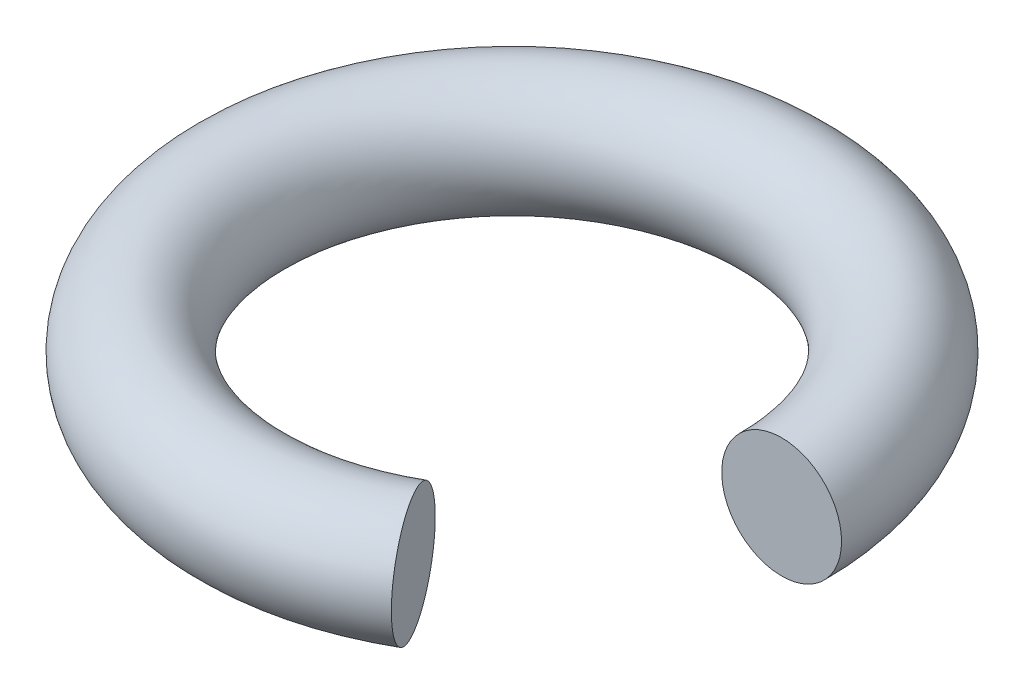
ISO-10303-21;
HEADER;
FILE_DESCRIPTION(('STEP AP214'),'2;1');
FILE_NAME('part.step','',(''),(''),'','','');
FILE_SCHEMA(('AUTOMOTIVE_DESIGN { 1 0 10303 214 1 1 1 1 }'));
ENDSEC;
DATA;
#1=APPLICATION_CONTEXT('core data for automotive mechanical design processes');
#2=APPLICATION_PROTOCOL_DEFINITION('international standard','automotive_design',2000,#1);
#3=PRODUCT_CONTEXT('',#1,'mechanical');
#4=PRODUCT('Part','Part','',(#3));
#5=PRODUCT_RELATED_PRODUCT_CATEGORY('part','',(#4));
#6=PRODUCT_DEFINITION_FORMATION('','',#4);
#7=PRODUCT_DEFINITION_CONTEXT('part definition',#1,'design');
#8=PRODUCT_DEFINITION('design','',#6,#7);
#9=PRODUCT_DEFINITION_SHAPE('','',#8);
#10=(LENGTH_UNIT() NAMED_UNIT(*) SI_UNIT(.MILLI.,.METRE.));
#11=(NAMED_UNIT(*) PLANE_ANGLE_UNIT() SI_UNIT($,.RADIAN.));
#12=(NAMED_UNIT(*) SI_UNIT($,.STERADIAN.) SOLID_ANGLE_UNIT());
#13=UNCERTAINTY_MEASURE_WITH_UNIT(LENGTH_MEASURE(1.E-05),#10,'distance_accuracy_value','');
#14=(GEOMETRIC_REPRESENTATION_CONTEXT(3) GLOBAL_UNCERTAINTY_ASSIGNED_CONTEXT((#13)) GLOBAL_UNIT_ASSIGNED_CONTEXT((#10,
#11,#12)) REPRESENTATION_CONTEXT('',''));
#15=CARTESIAN_POINT('',(0.,0.,0.));
#16=DIRECTION('',(0.,0.,1.));
#17=DIRECTION('',(1.,0.,0.));
#18=AXIS2_PLACEMENT_3D('',#15,#16,#17);
#19=CARTESIAN_POINT('',(0.,0.,0.));
#20=DIRECTION('',(0.,-1.,0.));
#21=DIRECTION('',(0.,0.,-1.));
#22=AXIS2_PLACEMENT_3D('',#19,#20,#21);
#23=TOROIDAL_SURFACE('',#22,2.7,0.6);
#24=CARTESIAN_POINT('',(1.35,0.,2.33826859021798));
#25=DIRECTION('',(-0.866025403784439,0.,0.5));
#26=DIRECTION('',(0.5,0.,0.866025403784439));
#27=AXIS2_PLACEMENT_3D('',#24,#25,#26);
#28=CIRCLE('',#27,0.6);
#29=CARTESIAN_POINT('',(1.65,0.,2.85788383248865));
#30=VERTEX_POINT('',#29);
#31=EDGE_CURVE('E10',#30,#30,#28,.T.);
#32=CARTESIAN_POINT('',(2.7,0.,0.));
#33=DIRECTION('',(0.,0.,1.));
#34=DIRECTION('',(1.,0.,0.));
#35=AXIS2_PLACEMENT_3D('',#32,#33,#34);
#36=CIRCLE('',#35,0.6);
#37=CARTESIAN_POINT('',(3.3,0.,0.));
#38=VERTEX_POINT('',#37);
#39=EDGE_CURVE('E41',#38,#38,#36,.T.);
#40=CARTESIAN_POINT('',(0.,0.,0.));
#41=DIRECTION('',(0.,-1.,0.));
#42=DIRECTION('',(0.,0.,-1.));
#43=AXIS2_PLACEMENT_3D('',#40,#41,#42);
#44=CIRCLE('',#43,3.3);
#45=EDGE_CURVE('',#30,#38,#44,.T.);
#46=ORIENTED_EDGE('',*,*,#31,.T.);
#47=ORIENTED_EDGE('',*,*,#39,.F.);
#48=ORIENTED_EDGE('',*,*,#45,.T.);
#49=ORIENTED_EDGE('',*,*,#45,.F.);
#50=EDGE_LOOP('',(#46,#48,#47,#49));
#51=FACE_BOUND('',#50,.T.);
#52=ADVANCED_FACE('F35',(#51),#23,.T.);
#53=CARTESIAN_POINT('',(1.35,0.,2.33826859021798));
#54=DIRECTION('',(-0.866025403784439,0.,0.5));
#55=DIRECTION('',(0.5,0.,0.866025403784439));
#56=AXIS2_PLACEMENT_3D('',#53,#54,#55);
#57=PLANE('',#56);
#58=ORIENTED_EDGE('',*,*,#31,.F.);
#59=EDGE_LOOP('',(#58));
#60=FACE_BOUND('',#59,.T.);
#61=ADVANCED_FACE('F50',(#60),#57,.F.);
#62=CARTESIAN_POINT('',(2.7,0.,0.));
#63=DIRECTION('',(0.,0.,1.));
#64=DIRECTION('',(1.,0.,0.));
#65=AXIS2_PLACEMENT_3D('',#62,#63,#64);
#66=PLANE('',#65);
#67=ORIENTED_EDGE('',*,*,#39,.T.);
#68=EDGE_LOOP('',(#67));
#69=FACE_BOUND('',#68,.T.);
#70=ADVANCED_FACE('F47',(#69),#66,.T.);
#71=CLOSED_SHELL('',(#52,#61,#70));
#72=MANIFOLD_SOLID_BREP('B2',#71);
#73=ADVANCED_BREP_SHAPE_REPRESENTATION('',(#18,#72),#14);
#74=SHAPE_DEFINITION_REPRESENTATION(#9,#73);
ENDSEC;
END-ISO-10303-21;
